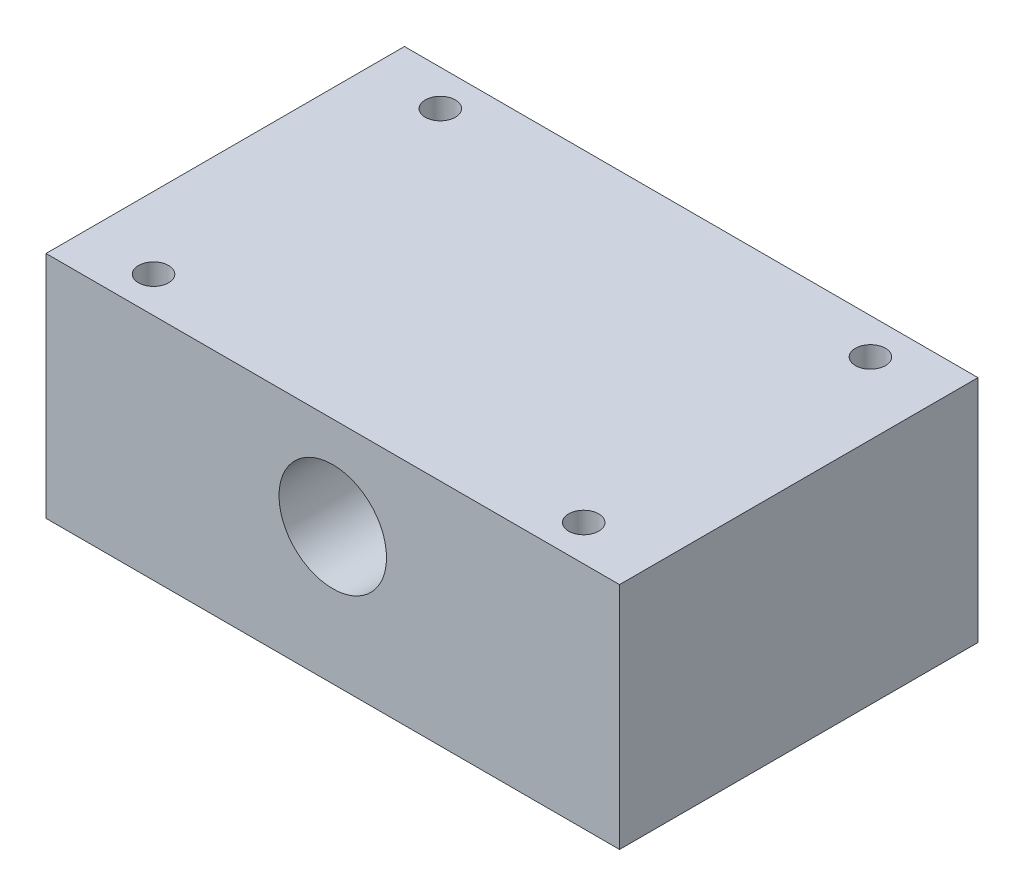
ISO-10303-21;
HEADER;
FILE_DESCRIPTION(('STEP AP214'),'2;1');
FILE_NAME('part.step','',(''),(''),'','','');
FILE_SCHEMA(('AUTOMOTIVE_DESIGN { 1 0 10303 214 1 1 1 1 }'));
ENDSEC;
DATA;
#1=APPLICATION_CONTEXT('core data for automotive mechanical design processes');
#2=APPLICATION_PROTOCOL_DEFINITION('international standard','automotive_design',2000,#1);
#3=PRODUCT_CONTEXT('',#1,'mechanical');
#4=PRODUCT('Part','Part','',(#3));
#5=PRODUCT_RELATED_PRODUCT_CATEGORY('part','',(#4));
#6=PRODUCT_DEFINITION_FORMATION('','',#4);
#7=PRODUCT_DEFINITION_CONTEXT('part definition',#1,'design');
#8=PRODUCT_DEFINITION('design','',#6,#7);
#9=PRODUCT_DEFINITION_SHAPE('','',#8);
#10=(LENGTH_UNIT() NAMED_UNIT(*) SI_UNIT(.MILLI.,.METRE.));
#11=(NAMED_UNIT(*) PLANE_ANGLE_UNIT() SI_UNIT($,.RADIAN.));
#12=(NAMED_UNIT(*) SI_UNIT($,.STERADIAN.) SOLID_ANGLE_UNIT());
#13=UNCERTAINTY_MEASURE_WITH_UNIT(LENGTH_MEASURE(1.E-05),#10,'distance_accuracy_value','');
#14=(GEOMETRIC_REPRESENTATION_CONTEXT(3) GLOBAL_UNCERTAINTY_ASSIGNED_CONTEXT((#13)) GLOBAL_UNIT_ASSIGNED_CONTEXT((#10,
#11,#12)) REPRESENTATION_CONTEXT('',''));
#15=CARTESIAN_POINT('',(0.,0.,0.));
#16=DIRECTION('',(0.,0.,1.));
#17=DIRECTION('',(1.,0.,0.));
#18=AXIS2_PLACEMENT_3D('',#15,#16,#17);
#19=CARTESIAN_POINT('',(40.,32.,25.));
#20=DIRECTION('',(-1.,0.,0.));
#21=DIRECTION('',(0.,0.,1.));
#22=AXIS2_PLACEMENT_3D('',#19,#20,#21);
#23=PLANE('',#22);
#24=DIRECTION('',(0.,0.,-1.));
#25=VECTOR('',#24,1.);
#26=CARTESIAN_POINT('',(40.,0.,25.));
#27=LINE('',#26,#25);
#28=CARTESIAN_POINT('',(40.,0.,25.));
#29=VERTEX_POINT('',#28);
#30=CARTESIAN_POINT('',(40.,0.,-25.));
#31=VERTEX_POINT('',#30);
#32=EDGE_CURVE('E160',#29,#31,#27,.T.);
#33=ORIENTED_EDGE('',*,*,#32,.T.);
#34=DIRECTION('',(0.,-1.,0.));
#35=VECTOR('',#34,1.);
#36=CARTESIAN_POINT('',(40.,32.,-25.));
#37=LINE('',#36,#35);
#38=CARTESIAN_POINT('',(40.,32.,-25.));
#39=VERTEX_POINT('',#38);
#40=EDGE_CURVE('E11',#39,#31,#37,.T.);
#41=ORIENTED_EDGE('',*,*,#40,.F.);
#42=DIRECTION('',(0.,0.,-1.));
#43=VECTOR('',#42,1.);
#44=CARTESIAN_POINT('',(40.,32.,25.));
#45=LINE('',#44,#43);
#46=CARTESIAN_POINT('',(40.,32.,25.));
#47=VERTEX_POINT('',#46);
#48=EDGE_CURVE('E153',#47,#39,#45,.T.);
#49=ORIENTED_EDGE('',*,*,#48,.F.);
#50=DIRECTION('',(0.,-1.,0.));
#51=VECTOR('',#50,1.);
#52=CARTESIAN_POINT('',(40.,32.,25.));
#53=LINE('',#52,#51);
#54=EDGE_CURVE('E159',#47,#29,#53,.T.);
#55=ORIENTED_EDGE('',*,*,#54,.T.);
#56=EDGE_LOOP('',(#33,#41,#49,#55));
#57=FACE_BOUND('',#56,.T.);
#58=ADVANCED_FACE('F38',(#57),#23,.F.);
#59=CARTESIAN_POINT('',(-40.,32.,-25.));
#60=DIRECTION('',(0.,0.,1.));
#61=DIRECTION('',(1.,0.,0.));
#62=AXIS2_PLACEMENT_3D('',#59,#60,#61);
#63=PLANE('',#62);
#64=CARTESIAN_POINT('',(0.,19.,-25.));
#65=DIRECTION('',(0.,0.,1.));
#66=DIRECTION('',(1.,0.,0.));
#67=AXIS2_PLACEMENT_3D('',#64,#65,#66);
#68=CIRCLE('',#67,7.5);
#69=CARTESIAN_POINT('',(7.5,19.,-25.));
#70=VERTEX_POINT('',#69);
#71=EDGE_CURVE('E150',#70,#70,#68,.T.);
#72=ORIENTED_EDGE('',*,*,#71,.T.);
#73=EDGE_LOOP('',(#72));
#74=FACE_BOUND('',#73,.T.);
#75=DIRECTION('',(-1.,0.,0.));
#76=VECTOR('',#75,1.);
#77=CARTESIAN_POINT('',(-40.,0.,-25.));
#78=LINE('',#77,#76);
#79=CARTESIAN_POINT('',(-40.,0.,-25.));
#80=VERTEX_POINT('',#79);
#81=EDGE_CURVE('E163',#31,#80,#78,.T.);
#82=ORIENTED_EDGE('',*,*,#81,.T.);
#83=DIRECTION('',(0.,-1.,0.));
#84=VECTOR('',#83,1.);
#85=CARTESIAN_POINT('',(-40.,32.,-25.));
#86=LINE('',#85,#84);
#87=CARTESIAN_POINT('',(-40.,32.,-25.));
#88=VERTEX_POINT('',#87);
#89=EDGE_CURVE('E47',#88,#80,#86,.T.);
#90=ORIENTED_EDGE('',*,*,#89,.F.);
#91=DIRECTION('',(-1.,0.,0.));
#92=VECTOR('',#91,1.);
#93=CARTESIAN_POINT('',(-40.,32.,-25.));
#94=LINE('',#93,#92);
#95=EDGE_CURVE('E86',#39,#88,#94,.T.);
#96=ORIENTED_EDGE('',*,*,#95,.F.);
#97=ORIENTED_EDGE('',*,*,#40,.T.);
#98=EDGE_LOOP('',(#82,#90,#96,#97));
#99=FACE_BOUND('',#98,.T.);
#100=ADVANCED_FACE('F189',(#74,#99),#63,.F.);
#101=CARTESIAN_POINT('',(-40.,32.,25.));
#102=DIRECTION('',(1.,0.,0.));
#103=DIRECTION('',(0.,0.,-1.));
#104=AXIS2_PLACEMENT_3D('',#101,#102,#103);
#105=PLANE('',#104);
#106=CARTESIAN_POINT('',(-40.,27.,-15.));
#107=DIRECTION('',(-1.,0.,0.));
#108=DIRECTION('',(0.,0.,1.));
#109=AXIS2_PLACEMENT_3D('',#106,#107,#108);
#110=CIRCLE('',#109,1.65);
#111=CARTESIAN_POINT('',(-40.,27.,-13.35));
#112=VERTEX_POINT('',#111);
#113=EDGE_CURVE('E116',#112,#112,#110,.T.);
#114=ORIENTED_EDGE('',*,*,#113,.F.);
#115=EDGE_LOOP('',(#114));
#116=FACE_BOUND('',#115,.T.);
#117=CARTESIAN_POINT('',(-40.,27.,15.));
#118=DIRECTION('',(-1.,0.,0.));
#119=DIRECTION('',(0.,0.,1.));
#120=AXIS2_PLACEMENT_3D('',#117,#118,#119);
#121=CIRCLE('',#120,1.65);
#122=CARTESIAN_POINT('',(-40.,27.,16.65));
#123=VERTEX_POINT('',#122);
#124=EDGE_CURVE('E115',#123,#123,#121,.T.);
#125=ORIENTED_EDGE('',*,*,#124,.F.);
#126=EDGE_LOOP('',(#125));
#127=FACE_BOUND('',#126,.T.);
#128=DIRECTION('',(0.,0.,1.));
#129=VECTOR('',#128,1.);
#130=CARTESIAN_POINT('',(-40.,0.,25.));
#131=LINE('',#130,#129);
#132=CARTESIAN_POINT('',(-40.,0.,25.));
#133=VERTEX_POINT('',#132);
#134=EDGE_CURVE('E73',#80,#133,#131,.T.);
#135=ORIENTED_EDGE('',*,*,#134,.T.);
#136=DIRECTION('',(0.,-1.,0.));
#137=VECTOR('',#136,1.);
#138=CARTESIAN_POINT('',(-40.,32.,25.));
#139=LINE('',#138,#137);
#140=CARTESIAN_POINT('',(-40.,32.,25.));
#141=VERTEX_POINT('',#140);
#142=EDGE_CURVE('E168',#141,#133,#139,.T.);
#143=ORIENTED_EDGE('',*,*,#142,.F.);
#144=DIRECTION('',(0.,0.,1.));
#145=VECTOR('',#144,1.);
#146=CARTESIAN_POINT('',(-40.,32.,25.));
#147=LINE('',#146,#145);
#148=EDGE_CURVE('E156',#88,#141,#147,.T.);
#149=ORIENTED_EDGE('',*,*,#148,.F.);
#150=ORIENTED_EDGE('',*,*,#89,.T.);
#151=EDGE_LOOP('',(#135,#143,#149,#150));
#152=FACE_BOUND('',#151,.T.);
#153=ADVANCED_FACE('F171',(#116,#127,#152),#105,.F.);
#154=CARTESIAN_POINT('',(-40.,32.,25.));
#155=DIRECTION('',(0.,0.,-1.));
#156=DIRECTION('',(-1.,0.,0.));
#157=AXIS2_PLACEMENT_3D('',#154,#155,#156);
#158=PLANE('',#157);
#159=CARTESIAN_POINT('',(0.,19.,25.));
#160=DIRECTION('',(0.,0.,-1.));
#161=DIRECTION('',(-1.,0.,0.));
#162=AXIS2_PLACEMENT_3D('',#159,#160,#161);
#163=CIRCLE('',#162,7.5);
#164=CARTESIAN_POINT('',(-7.5,19.,25.));
#165=VERTEX_POINT('',#164);
#166=EDGE_CURVE('E41',#165,#165,#163,.T.);
#167=ORIENTED_EDGE('',*,*,#166,.T.);
#168=EDGE_LOOP('',(#167));
#169=FACE_BOUND('',#168,.T.);
#170=DIRECTION('',(1.,0.,0.));
#171=VECTOR('',#170,1.);
#172=CARTESIAN_POINT('',(-40.,0.,25.));
#173=LINE('',#172,#171);
#174=EDGE_CURVE('E79',#133,#29,#173,.T.);
#175=ORIENTED_EDGE('',*,*,#174,.T.);
#176=ORIENTED_EDGE('',*,*,#54,.F.);
#177=DIRECTION('',(1.,0.,0.));
#178=VECTOR('',#177,1.);
#179=CARTESIAN_POINT('',(-40.,32.,25.));
#180=LINE('',#179,#178);
#181=EDGE_CURVE('E55',#141,#47,#180,.T.);
#182=ORIENTED_EDGE('',*,*,#181,.F.);
#183=ORIENTED_EDGE('',*,*,#142,.T.);
#184=EDGE_LOOP('',(#175,#176,#182,#183));
#185=FACE_BOUND('',#184,.T.);
#186=ADVANCED_FACE('F178',(#169,#185),#158,.F.);
#187=CARTESIAN_POINT('',(0.,32.,0.));
#188=DIRECTION('',(0.,-1.,0.));
#189=DIRECTION('',(0.,0.,-1.));
#190=AXIS2_PLACEMENT_3D('',#187,#188,#189);
#191=PLANE('',#190);
#192=CARTESIAN_POINT('',(-30.,32.,-20.));
#193=DIRECTION('',(0.,1.,0.));
#194=DIRECTION('',(0.,0.,1.));
#195=AXIS2_PLACEMENT_3D('',#192,#193,#194);
#196=CIRCLE('',#195,2.1);
#197=CARTESIAN_POINT('',(-30.,32.,-17.9));
#198=VERTEX_POINT('',#197);
#199=EDGE_CURVE('E126',#198,#198,#196,.T.);
#200=ORIENTED_EDGE('',*,*,#199,.F.);
#201=EDGE_LOOP('',(#200));
#202=FACE_BOUND('',#201,.T.);
#203=CARTESIAN_POINT('',(30.,32.,-20.));
#204=DIRECTION('',(0.,1.,0.));
#205=DIRECTION('',(0.,0.,1.));
#206=AXIS2_PLACEMENT_3D('',#203,#204,#205);
#207=CIRCLE('',#206,2.1);
#208=CARTESIAN_POINT('',(30.,32.,-17.9));
#209=VERTEX_POINT('',#208);
#210=EDGE_CURVE('E132',#209,#209,#207,.T.);
#211=ORIENTED_EDGE('',*,*,#210,.F.);
#212=EDGE_LOOP('',(#211));
#213=FACE_BOUND('',#212,.T.);
#214=CARTESIAN_POINT('',(30.,32.,20.));
#215=DIRECTION('',(0.,1.,0.));
#216=DIRECTION('',(0.,0.,1.));
#217=AXIS2_PLACEMENT_3D('',#214,#215,#216);
#218=CIRCLE('',#217,2.1);
#219=CARTESIAN_POINT('',(30.,32.,22.1));
#220=VERTEX_POINT('',#219);
#221=EDGE_CURVE('E138',#220,#220,#218,.T.);
#222=ORIENTED_EDGE('',*,*,#221,.F.);
#223=EDGE_LOOP('',(#222));
#224=FACE_BOUND('',#223,.T.);
#225=CARTESIAN_POINT('',(-30.,32.,20.));
#226=DIRECTION('',(0.,1.,0.));
#227=DIRECTION('',(0.,0.,1.));
#228=AXIS2_PLACEMENT_3D('',#225,#226,#227);
#229=CIRCLE('',#228,2.1);
#230=CARTESIAN_POINT('',(-30.,32.,22.1));
#231=VERTEX_POINT('',#230);
#232=EDGE_CURVE('E144',#231,#231,#229,.T.);
#233=ORIENTED_EDGE('',*,*,#232,.F.);
#234=EDGE_LOOP('',(#233));
#235=FACE_BOUND('',#234,.T.);
#236=ORIENTED_EDGE('',*,*,#48,.T.);
#237=ORIENTED_EDGE('',*,*,#95,.T.);
#238=ORIENTED_EDGE('',*,*,#148,.T.);
#239=ORIENTED_EDGE('',*,*,#181,.T.);
#240=EDGE_LOOP('',(#236,#237,#238,#239));
#241=FACE_BOUND('',#240,.T.);
#242=ADVANCED_FACE('F180',(#202,#213,#224,#235,#241),#191,.F.);
#243=CARTESIAN_POINT('',(0.,0.,0.));
#244=DIRECTION('',(0.,-1.,0.));
#245=DIRECTION('',(0.,0.,-1.));
#246=AXIS2_PLACEMENT_3D('',#243,#244,#245);
#247=PLANE('',#246);
#248=ORIENTED_EDGE('',*,*,#32,.F.);
#249=ORIENTED_EDGE('',*,*,#174,.F.);
#250=ORIENTED_EDGE('',*,*,#134,.F.);
#251=ORIENTED_EDGE('',*,*,#81,.F.);
#252=EDGE_LOOP('',(#248,#249,#250,#251));
#253=FACE_BOUND('',#252,.T.);
#254=ADVANCED_FACE('F174',(#253),#247,.T.);
#255=CARTESIAN_POINT('',(0.,19.,-25.));
#256=DIRECTION('',(0.,0.,1.));
#257=DIRECTION('',(1.,0.,0.));
#258=AXIS2_PLACEMENT_3D('',#255,#256,#257);
#259=CYLINDRICAL_SURFACE('',#258,7.5);
#260=ORIENTED_EDGE('',*,*,#71,.F.);
#261=EDGE_LOOP('',(#260));
#262=FACE_BOUND('',#261,.T.);
#263=ORIENTED_EDGE('',*,*,#166,.F.);
#264=EDGE_LOOP('',(#263));
#265=FACE_BOUND('',#264,.T.);
#266=ADVANCED_FACE('F203',(#262,#265),#259,.F.);
#267=CARTESIAN_POINT('',(-30.,20.8618072999579,20.));
#268=DIRECTION('',(0.,1.,0.));
#269=DIRECTION('',(0.,0.,1.));
#270=AXIS2_PLACEMENT_3D('',#267,#268,#269);
#271=CONICAL_SURFACE('',#270,2.1,1.02974425867665);
#272=CARTESIAN_POINT('',(-30.,19.6,20.));
#273=VERTEX_POINT('',#272);
#274=VERTEX_LOOP('',#273);
#275=FACE_BOUND('',#274,.T.);
#276=CARTESIAN_POINT('',(-30.,20.8618072999579,20.));
#277=DIRECTION('',(0.,1.,0.));
#278=DIRECTION('',(0.,0.,1.));
#279=AXIS2_PLACEMENT_3D('',#276,#277,#278);
#280=CIRCLE('',#279,2.1);
#281=CARTESIAN_POINT('',(-30.,20.8618072999579,22.1));
#282=VERTEX_POINT('',#281);
#283=EDGE_CURVE('E147',#282,#282,#280,.T.);
#284=ORIENTED_EDGE('',*,*,#283,.T.);
#285=EDGE_LOOP('',(#284));
#286=FACE_BOUND('',#285,.T.);
#287=ADVANCED_FACE('F206',(#275,#286),#271,.F.);
#288=CARTESIAN_POINT('',(-30.,32.,20.));
#289=DIRECTION('',(0.,1.,0.));
#290=DIRECTION('',(0.,0.,1.));
#291=AXIS2_PLACEMENT_3D('',#288,#289,#290);
#292=CYLINDRICAL_SURFACE('',#291,2.1);
#293=ORIENTED_EDGE('',*,*,#283,.F.);
#294=EDGE_LOOP('',(#293));
#295=FACE_BOUND('',#294,.T.);
#296=ORIENTED_EDGE('',*,*,#232,.T.);
#297=EDGE_LOOP('',(#296));
#298=FACE_BOUND('',#297,.T.);
#299=ADVANCED_FACE('F213',(#295,#298),#292,.F.);
#300=CARTESIAN_POINT('',(30.,20.8618072999579,20.));
#301=DIRECTION('',(0.,1.,0.));
#302=DIRECTION('',(0.,0.,1.));
#303=AXIS2_PLACEMENT_3D('',#300,#301,#302);
#304=CONICAL_SURFACE('',#303,2.1,1.02974425867665);
#305=CARTESIAN_POINT('',(30.,19.6,20.));
#306=VERTEX_POINT('',#305);
#307=VERTEX_LOOP('',#306);
#308=FACE_BOUND('',#307,.T.);
#309=CARTESIAN_POINT('',(30.,20.8618072999579,20.));
#310=DIRECTION('',(0.,1.,0.));
#311=DIRECTION('',(0.,0.,1.));
#312=AXIS2_PLACEMENT_3D('',#309,#310,#311);
#313=CIRCLE('',#312,2.1);
#314=CARTESIAN_POINT('',(30.,20.8618072999579,22.1));
#315=VERTEX_POINT('',#314);
#316=EDGE_CURVE('E141',#315,#315,#313,.T.);
#317=ORIENTED_EDGE('',*,*,#316,.T.);
#318=EDGE_LOOP('',(#317));
#319=FACE_BOUND('',#318,.T.);
#320=ADVANCED_FACE('F219',(#308,#319),#304,.F.);
#321=CARTESIAN_POINT('',(30.,32.,20.));
#322=DIRECTION('',(0.,1.,0.));
#323=DIRECTION('',(0.,0.,1.));
#324=AXIS2_PLACEMENT_3D('',#321,#322,#323);
#325=CYLINDRICAL_SURFACE('',#324,2.1);
#326=ORIENTED_EDGE('',*,*,#316,.F.);
#327=EDGE_LOOP('',(#326));
#328=FACE_BOUND('',#327,.T.);
#329=ORIENTED_EDGE('',*,*,#221,.T.);
#330=EDGE_LOOP('',(#329));
#331=FACE_BOUND('',#330,.T.);
#332=ADVANCED_FACE('F223',(#328,#331),#325,.F.);
#333=CARTESIAN_POINT('',(30.,20.8618072999579,-20.));
#334=DIRECTION('',(0.,1.,0.));
#335=DIRECTION('',(0.,0.,1.));
#336=AXIS2_PLACEMENT_3D('',#333,#334,#335);
#337=CONICAL_SURFACE('',#336,2.1,1.02974425867665);
#338=CARTESIAN_POINT('',(30.,19.6,-20.));
#339=VERTEX_POINT('',#338);
#340=VERTEX_LOOP('',#339);
#341=FACE_BOUND('',#340,.T.);
#342=CARTESIAN_POINT('',(30.,20.8618072999579,-20.));
#343=DIRECTION('',(0.,1.,0.));
#344=DIRECTION('',(0.,0.,1.));
#345=AXIS2_PLACEMENT_3D('',#342,#343,#344);
#346=CIRCLE('',#345,2.1);
#347=CARTESIAN_POINT('',(30.,20.8618072999579,-17.9));
#348=VERTEX_POINT('',#347);
#349=EDGE_CURVE('E135',#348,#348,#346,.T.);
#350=ORIENTED_EDGE('',*,*,#349,.T.);
#351=EDGE_LOOP('',(#350));
#352=FACE_BOUND('',#351,.T.);
#353=ADVANCED_FACE('F227',(#341,#352),#337,.F.);
#354=CARTESIAN_POINT('',(30.,32.,-20.));
#355=DIRECTION('',(0.,1.,0.));
#356=DIRECTION('',(0.,0.,1.));
#357=AXIS2_PLACEMENT_3D('',#354,#355,#356);
#358=CYLINDRICAL_SURFACE('',#357,2.1);
#359=ORIENTED_EDGE('',*,*,#349,.F.);
#360=EDGE_LOOP('',(#359));
#361=FACE_BOUND('',#360,.T.);
#362=ORIENTED_EDGE('',*,*,#210,.T.);
#363=EDGE_LOOP('',(#362));
#364=FACE_BOUND('',#363,.T.);
#365=ADVANCED_FACE('F231',(#361,#364),#358,.F.);
#366=CARTESIAN_POINT('',(-30.,20.8618072999579,-20.));
#367=DIRECTION('',(0.,1.,0.));
#368=DIRECTION('',(0.,0.,1.));
#369=AXIS2_PLACEMENT_3D('',#366,#367,#368);
#370=CONICAL_SURFACE('',#369,2.1,1.02974425867665);
#371=CARTESIAN_POINT('',(-30.,19.6,-20.));
#372=VERTEX_POINT('',#371);
#373=VERTEX_LOOP('',#372);
#374=FACE_BOUND('',#373,.T.);
#375=CARTESIAN_POINT('',(-30.,20.8618072999579,-20.));
#376=DIRECTION('',(0.,1.,0.));
#377=DIRECTION('',(0.,0.,1.));
#378=AXIS2_PLACEMENT_3D('',#375,#376,#377);
#379=CIRCLE('',#378,2.1);
#380=CARTESIAN_POINT('',(-30.,20.8618072999579,-17.9));
#381=VERTEX_POINT('',#380);
#382=EDGE_CURVE('E129',#381,#381,#379,.T.);
#383=ORIENTED_EDGE('',*,*,#382,.T.);
#384=EDGE_LOOP('',(#383));
#385=FACE_BOUND('',#384,.T.);
#386=ADVANCED_FACE('F235',(#374,#385),#370,.F.);
#387=CARTESIAN_POINT('',(-30.,32.,-20.));
#388=DIRECTION('',(0.,1.,0.));
#389=DIRECTION('',(0.,0.,1.));
#390=AXIS2_PLACEMENT_3D('',#387,#388,#389);
#391=CYLINDRICAL_SURFACE('',#390,2.1);
#392=ORIENTED_EDGE('',*,*,#382,.F.);
#393=EDGE_LOOP('',(#392));
#394=FACE_BOUND('',#393,.T.);
#395=ORIENTED_EDGE('',*,*,#199,.T.);
#396=EDGE_LOOP('',(#395));
#397=FACE_BOUND('',#396,.T.);
#398=ADVANCED_FACE('F239',(#394,#397),#391,.F.);
#399=CARTESIAN_POINT('',(-30.8914200213955,27.,15.));
#400=DIRECTION('',(-1.,0.,0.));
#401=DIRECTION('',(0.,0.,1.));
#402=AXIS2_PLACEMENT_3D('',#399,#400,#401);
#403=CONICAL_SURFACE('',#402,1.65,1.02974425867665);
#404=CARTESIAN_POINT('',(-29.9,27.,15.));
#405=VERTEX_POINT('',#404);
#406=VERTEX_LOOP('',#405);
#407=FACE_BOUND('',#406,.T.);
#408=CARTESIAN_POINT('',(-30.8914200213955,27.,15.));
#409=DIRECTION('',(-1.,0.,0.));
#410=DIRECTION('',(0.,0.,1.));
#411=AXIS2_PLACEMENT_3D('',#408,#409,#410);
#412=CIRCLE('',#411,1.65);
#413=CARTESIAN_POINT('',(-30.8914200213955,27.,16.65));
#414=VERTEX_POINT('',#413);
#415=EDGE_CURVE('E119',#414,#414,#412,.T.);
#416=ORIENTED_EDGE('',*,*,#415,.T.);
#417=EDGE_LOOP('',(#416));
#418=FACE_BOUND('',#417,.T.);
#419=ADVANCED_FACE('F243',(#407,#418),#403,.F.);
#420=CARTESIAN_POINT('',(-40.,27.,15.));
#421=DIRECTION('',(-1.,0.,0.));
#422=DIRECTION('',(0.,0.,1.));
#423=AXIS2_PLACEMENT_3D('',#420,#421,#422);
#424=CYLINDRICAL_SURFACE('',#423,1.65);
#425=ORIENTED_EDGE('',*,*,#415,.F.);
#426=EDGE_LOOP('',(#425));
#427=FACE_BOUND('',#426,.T.);
#428=ORIENTED_EDGE('',*,*,#124,.T.);
#429=EDGE_LOOP('',(#428));
#430=FACE_BOUND('',#429,.T.);
#431=ADVANCED_FACE('F109',(#427,#430),#424,.F.);
#432=CARTESIAN_POINT('',(-30.8914200213955,27.,-15.));
#433=DIRECTION('',(-1.,0.,0.));
#434=DIRECTION('',(0.,0.,1.));
#435=AXIS2_PLACEMENT_3D('',#432,#433,#434);
#436=CONICAL_SURFACE('',#435,1.65,1.02974425867665);
#437=CARTESIAN_POINT('',(-29.9,27.,-15.));
#438=VERTEX_POINT('',#437);
#439=VERTEX_LOOP('',#438);
#440=FACE_BOUND('',#439,.T.);
#441=CARTESIAN_POINT('',(-30.8914200213955,27.,-15.));
#442=DIRECTION('',(-1.,0.,0.));
#443=DIRECTION('',(0.,0.,1.));
#444=AXIS2_PLACEMENT_3D('',#441,#442,#443);
#445=CIRCLE('',#444,1.65);
#446=CARTESIAN_POINT('',(-30.8914200213955,27.,-13.35));
#447=VERTEX_POINT('',#446);
#448=EDGE_CURVE('E113',#447,#447,#445,.T.);
#449=ORIENTED_EDGE('',*,*,#448,.T.);
#450=EDGE_LOOP('',(#449));
#451=FACE_BOUND('',#450,.T.);
#452=ADVANCED_FACE('F105',(#440,#451),#436,.F.);
#453=CARTESIAN_POINT('',(-40.,27.,-15.));
#454=DIRECTION('',(-1.,0.,0.));
#455=DIRECTION('',(0.,0.,1.));
#456=AXIS2_PLACEMENT_3D('',#453,#454,#455);
#457=CYLINDRICAL_SURFACE('',#456,1.65);
#458=ORIENTED_EDGE('',*,*,#448,.F.);
#459=EDGE_LOOP('',(#458));
#460=FACE_BOUND('',#459,.T.);
#461=ORIENTED_EDGE('',*,*,#113,.T.);
#462=EDGE_LOOP('',(#461));
#463=FACE_BOUND('',#462,.T.);
#464=ADVANCED_FACE('F108',(#460,#463),#457,.F.);
#465=CLOSED_SHELL('',(#58,#100,#153,#186,#242,#254,#266,#287,#299,#320,#332,#353,#365,#386,#398,
#419,#431,#452,#464));
#466=MANIFOLD_SOLID_BREP('B2',#465);
#467=ADVANCED_BREP_SHAPE_REPRESENTATION('',(#18,#466),#14);
#468=SHAPE_DEFINITION_REPRESENTATION(#9,#467);
ENDSEC;
END-ISO-10303-21;
